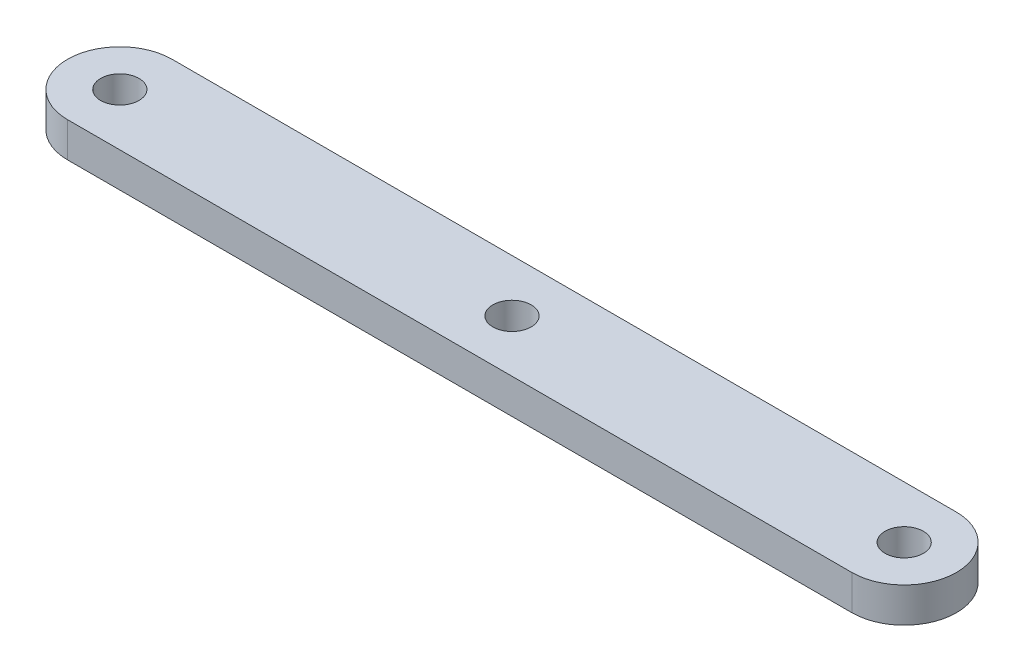
ISO-10303-21;
HEADER;
FILE_DESCRIPTION(('STEP AP214'),'2;1');
FILE_NAME('part.step','',(''),(''),'','','');
FILE_SCHEMA(('AUTOMOTIVE_DESIGN { 1 0 10303 214 1 1 1 1 }'));
ENDSEC;
DATA;
#1=APPLICATION_CONTEXT('core data for automotive mechanical design processes');
#2=APPLICATION_PROTOCOL_DEFINITION('international standard','automotive_design',2000,#1);
#3=PRODUCT_CONTEXT('',#1,'mechanical');
#4=PRODUCT('Part','Part','',(#3));
#5=PRODUCT_RELATED_PRODUCT_CATEGORY('part','',(#4));
#6=PRODUCT_DEFINITION_FORMATION('','',#4);
#7=PRODUCT_DEFINITION_CONTEXT('part definition',#1,'design');
#8=PRODUCT_DEFINITION('design','',#6,#7);
#9=PRODUCT_DEFINITION_SHAPE('','',#8);
#10=(LENGTH_UNIT() NAMED_UNIT(*) SI_UNIT(.MILLI.,.METRE.));
#11=(NAMED_UNIT(*) PLANE_ANGLE_UNIT() SI_UNIT($,.RADIAN.));
#12=(NAMED_UNIT(*) SI_UNIT($,.STERADIAN.) SOLID_ANGLE_UNIT());
#13=UNCERTAINTY_MEASURE_WITH_UNIT(LENGTH_MEASURE(1.E-05),#10,'distance_accuracy_value','');
#14=(GEOMETRIC_REPRESENTATION_CONTEXT(3) GLOBAL_UNCERTAINTY_ASSIGNED_CONTEXT((#13)) GLOBAL_UNIT_ASSIGNED_CONTEXT((#10,
#11,#12)) REPRESENTATION_CONTEXT('',''));
#15=CARTESIAN_POINT('',(0.,0.,0.));
#16=DIRECTION('',(0.,0.,1.));
#17=DIRECTION('',(1.,0.,0.));
#18=AXIS2_PLACEMENT_3D('',#15,#16,#17);
#19=CARTESIAN_POINT('',(0.,2.,0.));
#20=DIRECTION('',(0.,-1.,0.));
#21=DIRECTION('',(0.,0.,-1.));
#22=AXIS2_PLACEMENT_3D('',#19,#20,#21);
#23=CYLINDRICAL_SURFACE('',#22,3.);
#24=CARTESIAN_POINT('',(0.,0.,0.));
#25=DIRECTION('',(0.,1.,0.));
#26=DIRECTION('',(0.,0.,1.));
#27=AXIS2_PLACEMENT_3D('',#24,#25,#26);
#28=CIRCLE('',#27,3.);
#29=CARTESIAN_POINT('',(0.,0.,-3.));
#30=VERTEX_POINT('',#29);
#31=CARTESIAN_POINT('',(0.,0.,3.));
#32=VERTEX_POINT('',#31);
#33=EDGE_CURVE('E111',#30,#32,#28,.T.);
#34=ORIENTED_EDGE('',*,*,#33,.T.);
#35=DIRECTION('',(0.,-1.,0.));
#36=VECTOR('',#35,1.);
#37=CARTESIAN_POINT('',(0.,2.,3.));
#38=LINE('',#37,#36);
#39=CARTESIAN_POINT('',(0.,2.,3.));
#40=VERTEX_POINT('',#39);
#41=EDGE_CURVE('E11',#40,#32,#38,.T.);
#42=ORIENTED_EDGE('',*,*,#41,.F.);
#43=CARTESIAN_POINT('',(0.,2.,0.));
#44=DIRECTION('',(0.,1.,0.));
#45=DIRECTION('',(0.,0.,1.));
#46=AXIS2_PLACEMENT_3D('',#43,#44,#45);
#47=CIRCLE('',#46,3.);
#48=CARTESIAN_POINT('',(0.,2.,-3.));
#49=VERTEX_POINT('',#48);
#50=EDGE_CURVE('E95',#49,#40,#47,.T.);
#51=ORIENTED_EDGE('',*,*,#50,.F.);
#52=DIRECTION('',(0.,-1.,0.));
#53=VECTOR('',#52,1.);
#54=CARTESIAN_POINT('',(0.,2.,-3.));
#55=LINE('',#54,#53);
#56=EDGE_CURVE('E107',#49,#30,#55,.T.);
#57=ORIENTED_EDGE('',*,*,#56,.T.);
#58=EDGE_LOOP('',(#34,#42,#51,#57));
#59=FACE_BOUND('',#58,.T.);
#60=ADVANCED_FACE('F43',(#59),#23,.T.);
#61=CARTESIAN_POINT('',(0.,2.,3.));
#62=DIRECTION('',(0.,0.,-1.));
#63=DIRECTION('',(-1.,0.,0.));
#64=AXIS2_PLACEMENT_3D('',#61,#62,#63);
#65=PLANE('',#64);
#66=DIRECTION('',(1.,0.,0.));
#67=VECTOR('',#66,1.);
#68=CARTESIAN_POINT('',(0.,0.,3.));
#69=LINE('',#68,#67);
#70=CARTESIAN_POINT('',(45.,0.,3.));
#71=VERTEX_POINT('',#70);
#72=EDGE_CURVE('E100',#32,#71,#69,.T.);
#73=ORIENTED_EDGE('',*,*,#72,.T.);
#74=DIRECTION('',(0.,-1.,0.));
#75=VECTOR('',#74,1.);
#76=CARTESIAN_POINT('',(45.,2.,3.));
#77=LINE('',#76,#75);
#78=CARTESIAN_POINT('',(45.,2.,3.));
#79=VERTEX_POINT('',#78);
#80=EDGE_CURVE('E52',#79,#71,#77,.T.);
#81=ORIENTED_EDGE('',*,*,#80,.F.);
#82=DIRECTION('',(1.,0.,0.));
#83=VECTOR('',#82,1.);
#84=CARTESIAN_POINT('',(0.,2.,3.));
#85=LINE('',#84,#83);
#86=EDGE_CURVE('E90',#40,#79,#85,.T.);
#87=ORIENTED_EDGE('',*,*,#86,.F.);
#88=ORIENTED_EDGE('',*,*,#41,.T.);
#89=EDGE_LOOP('',(#73,#81,#87,#88));
#90=FACE_BOUND('',#89,.T.);
#91=ADVANCED_FACE('F99',(#90),#65,.F.);
#92=CARTESIAN_POINT('',(45.,2.,0.));
#93=DIRECTION('',(0.,-1.,0.));
#94=DIRECTION('',(0.,0.,-1.));
#95=AXIS2_PLACEMENT_3D('',#92,#93,#94);
#96=CYLINDRICAL_SURFACE('',#95,3.);
#97=CARTESIAN_POINT('',(45.,0.,0.));
#98=DIRECTION('',(0.,1.,0.));
#99=DIRECTION('',(0.,0.,1.));
#100=AXIS2_PLACEMENT_3D('',#97,#98,#99);
#101=CIRCLE('',#100,3.);
#102=CARTESIAN_POINT('',(45.,0.,-3.));
#103=VERTEX_POINT('',#102);
#104=EDGE_CURVE('E77',#71,#103,#101,.T.);
#105=ORIENTED_EDGE('',*,*,#104,.T.);
#106=DIRECTION('',(0.,-1.,0.));
#107=VECTOR('',#106,1.);
#108=CARTESIAN_POINT('',(45.,2.,-3.));
#109=LINE('',#108,#107);
#110=CARTESIAN_POINT('',(45.,2.,-3.));
#111=VERTEX_POINT('',#110);
#112=EDGE_CURVE('E102',#111,#103,#109,.T.);
#113=ORIENTED_EDGE('',*,*,#112,.F.);
#114=CARTESIAN_POINT('',(45.,2.,0.));
#115=DIRECTION('',(0.,1.,0.));
#116=DIRECTION('',(0.,0.,1.));
#117=AXIS2_PLACEMENT_3D('',#114,#115,#116);
#118=CIRCLE('',#117,3.);
#119=EDGE_CURVE('E93',#79,#111,#118,.T.);
#120=ORIENTED_EDGE('',*,*,#119,.F.);
#121=ORIENTED_EDGE('',*,*,#80,.T.);
#122=EDGE_LOOP('',(#105,#113,#120,#121));
#123=FACE_BOUND('',#122,.T.);
#124=ADVANCED_FACE('F103',(#123),#96,.T.);
#125=CARTESIAN_POINT('',(0.,2.,-3.));
#126=DIRECTION('',(0.,0.,1.));
#127=DIRECTION('',(1.,0.,0.));
#128=AXIS2_PLACEMENT_3D('',#125,#126,#127);
#129=PLANE('',#128);
#130=DIRECTION('',(-1.,0.,0.));
#131=VECTOR('',#130,1.);
#132=CARTESIAN_POINT('',(0.,0.,-3.));
#133=LINE('',#132,#131);
#134=EDGE_CURVE('E83',#103,#30,#133,.T.);
#135=ORIENTED_EDGE('',*,*,#134,.T.);
#136=ORIENTED_EDGE('',*,*,#56,.F.);
#137=DIRECTION('',(-1.,0.,0.));
#138=VECTOR('',#137,1.);
#139=CARTESIAN_POINT('',(0.,2.,-3.));
#140=LINE('',#139,#138);
#141=EDGE_CURVE('E60',#111,#49,#140,.T.);
#142=ORIENTED_EDGE('',*,*,#141,.F.);
#143=ORIENTED_EDGE('',*,*,#112,.T.);
#144=EDGE_LOOP('',(#135,#136,#142,#143));
#145=FACE_BOUND('',#144,.T.);
#146=ADVANCED_FACE('F125',(#145),#129,.F.);
#147=CARTESIAN_POINT('',(0.,2.,0.));
#148=DIRECTION('',(0.,1.,0.));
#149=DIRECTION('',(0.,0.,1.));
#150=AXIS2_PLACEMENT_3D('',#147,#148,#149);
#151=PLANE('',#150);
#152=CARTESIAN_POINT('',(0.,2.,0.));
#153=DIRECTION('',(0.,1.,0.));
#154=DIRECTION('',(0.,0.,1.));
#155=AXIS2_PLACEMENT_3D('',#152,#153,#154);
#156=CIRCLE('',#155,1.1);
#157=CARTESIAN_POINT('',(0.,2.,1.1));
#158=VERTEX_POINT('',#157);
#159=EDGE_CURVE('E148',#158,#158,#156,.T.);
#160=ORIENTED_EDGE('',*,*,#159,.F.);
#161=EDGE_LOOP('',(#160));
#162=FACE_BOUND('',#161,.T.);
#163=CARTESIAN_POINT('',(45.,2.,0.));
#164=DIRECTION('',(0.,1.,0.));
#165=DIRECTION('',(0.,0.,1.));
#166=AXIS2_PLACEMENT_3D('',#163,#164,#165);
#167=CIRCLE('',#166,1.10000000000001);
#168=CARTESIAN_POINT('',(45.,2.,1.10000000000001));
#169=VERTEX_POINT('',#168);
#170=EDGE_CURVE('E144',#169,#169,#167,.T.);
#171=ORIENTED_EDGE('',*,*,#170,.F.);
#172=EDGE_LOOP('',(#171));
#173=FACE_BOUND('',#172,.T.);
#174=CARTESIAN_POINT('',(22.5,2.,0.));
#175=DIRECTION('',(0.,1.,0.));
#176=DIRECTION('',(0.,0.,1.));
#177=AXIS2_PLACEMENT_3D('',#174,#175,#176);
#178=CIRCLE('',#177,1.1);
#179=CARTESIAN_POINT('',(22.5,2.,1.1));
#180=VERTEX_POINT('',#179);
#181=EDGE_CURVE('E136',#180,#180,#178,.T.);
#182=ORIENTED_EDGE('',*,*,#181,.F.);
#183=EDGE_LOOP('',(#182));
#184=FACE_BOUND('',#183,.T.);
#185=ORIENTED_EDGE('',*,*,#50,.T.);
#186=ORIENTED_EDGE('',*,*,#86,.T.);
#187=ORIENTED_EDGE('',*,*,#119,.T.);
#188=ORIENTED_EDGE('',*,*,#141,.T.);
#189=EDGE_LOOP('',(#185,#186,#187,#188));
#190=FACE_BOUND('',#189,.T.);
#191=ADVANCED_FACE('F91',(#162,#173,#184,#190),#151,.T.);
#192=CARTESIAN_POINT('',(0.,0.,0.));
#193=DIRECTION('',(0.,1.,0.));
#194=DIRECTION('',(0.,0.,1.));
#195=AXIS2_PLACEMENT_3D('',#192,#193,#194);
#196=PLANE('',#195);
#197=CARTESIAN_POINT('',(0.,0.,0.));
#198=DIRECTION('',(0.,1.,0.));
#199=DIRECTION('',(0.,0.,1.));
#200=AXIS2_PLACEMENT_3D('',#197,#198,#199);
#201=CIRCLE('',#200,1.1);
#202=CARTESIAN_POINT('',(0.,0.,1.1));
#203=VERTEX_POINT('',#202);
#204=EDGE_CURVE('E115',#203,#203,#201,.T.);
#205=ORIENTED_EDGE('',*,*,#204,.T.);
#206=EDGE_LOOP('',(#205));
#207=FACE_BOUND('',#206,.T.);
#208=CARTESIAN_POINT('',(45.,0.,0.));
#209=DIRECTION('',(0.,1.,0.));
#210=DIRECTION('',(0.,0.,1.));
#211=AXIS2_PLACEMENT_3D('',#208,#209,#210);
#212=CIRCLE('',#211,1.10000000000001);
#213=CARTESIAN_POINT('',(45.,0.,1.10000000000001));
#214=VERTEX_POINT('',#213);
#215=EDGE_CURVE('E140',#214,#214,#212,.T.);
#216=ORIENTED_EDGE('',*,*,#215,.T.);
#217=EDGE_LOOP('',(#216));
#218=FACE_BOUND('',#217,.T.);
#219=CARTESIAN_POINT('',(22.5,0.,0.));
#220=DIRECTION('',(0.,1.,0.));
#221=DIRECTION('',(0.,0.,1.));
#222=AXIS2_PLACEMENT_3D('',#219,#220,#221);
#223=CIRCLE('',#222,1.1);
#224=CARTESIAN_POINT('',(22.5,0.,1.1));
#225=VERTEX_POINT('',#224);
#226=EDGE_CURVE('E132',#225,#225,#223,.T.);
#227=ORIENTED_EDGE('',*,*,#226,.T.);
#228=EDGE_LOOP('',(#227));
#229=FACE_BOUND('',#228,.T.);
#230=ORIENTED_EDGE('',*,*,#33,.F.);
#231=ORIENTED_EDGE('',*,*,#134,.F.);
#232=ORIENTED_EDGE('',*,*,#104,.F.);
#233=ORIENTED_EDGE('',*,*,#72,.F.);
#234=EDGE_LOOP('',(#230,#231,#232,#233));
#235=FACE_BOUND('',#234,.T.);
#236=ADVANCED_FACE('F128',(#207,#218,#229,#235),#196,.F.);
#237=CARTESIAN_POINT('',(22.5,0.,0.));
#238=DIRECTION('',(0.,1.,0.));
#239=DIRECTION('',(0.,0.,1.));
#240=AXIS2_PLACEMENT_3D('',#237,#238,#239);
#241=CYLINDRICAL_SURFACE('',#240,1.1);
#242=ORIENTED_EDGE('',*,*,#226,.F.);
#243=EDGE_LOOP('',(#242));
#244=FACE_BOUND('',#243,.T.);
#245=ORIENTED_EDGE('',*,*,#181,.T.);
#246=EDGE_LOOP('',(#245));
#247=FACE_BOUND('',#246,.T.);
#248=ADVANCED_FACE('F172',(#244,#247),#241,.F.);
#249=CARTESIAN_POINT('',(45.,0.,0.));
#250=DIRECTION('',(0.,1.,0.));
#251=DIRECTION('',(0.,0.,1.));
#252=AXIS2_PLACEMENT_3D('',#249,#250,#251);
#253=CYLINDRICAL_SURFACE('',#252,1.10000000000001);
#254=ORIENTED_EDGE('',*,*,#215,.F.);
#255=EDGE_LOOP('',(#254));
#256=FACE_BOUND('',#255,.T.);
#257=ORIENTED_EDGE('',*,*,#170,.T.);
#258=EDGE_LOOP('',(#257));
#259=FACE_BOUND('',#258,.T.);
#260=ADVANCED_FACE('F161',(#256,#259),#253,.F.);
#261=CARTESIAN_POINT('',(0.,0.,0.));
#262=DIRECTION('',(0.,1.,0.));
#263=DIRECTION('',(0.,0.,1.));
#264=AXIS2_PLACEMENT_3D('',#261,#262,#263);
#265=CYLINDRICAL_SURFACE('',#264,1.1);
#266=ORIENTED_EDGE('',*,*,#204,.F.);
#267=EDGE_LOOP('',(#266));
#268=FACE_BOUND('',#267,.T.);
#269=ORIENTED_EDGE('',*,*,#159,.T.);
#270=EDGE_LOOP('',(#269));
#271=FACE_BOUND('',#270,.T.);
#272=ADVANCED_FACE('F158',(#268,#271),#265,.F.);
#273=CLOSED_SHELL('',(#60,#91,#124,#146,#191,#236,#248,#260,#272));
#274=MANIFOLD_SOLID_BREP('B2',#273);
#275=ADVANCED_BREP_SHAPE_REPRESENTATION('',(#18,#274),#14);
#276=SHAPE_DEFINITION_REPRESENTATION(#9,#275);
ENDSEC;
END-ISO-10303-21;
